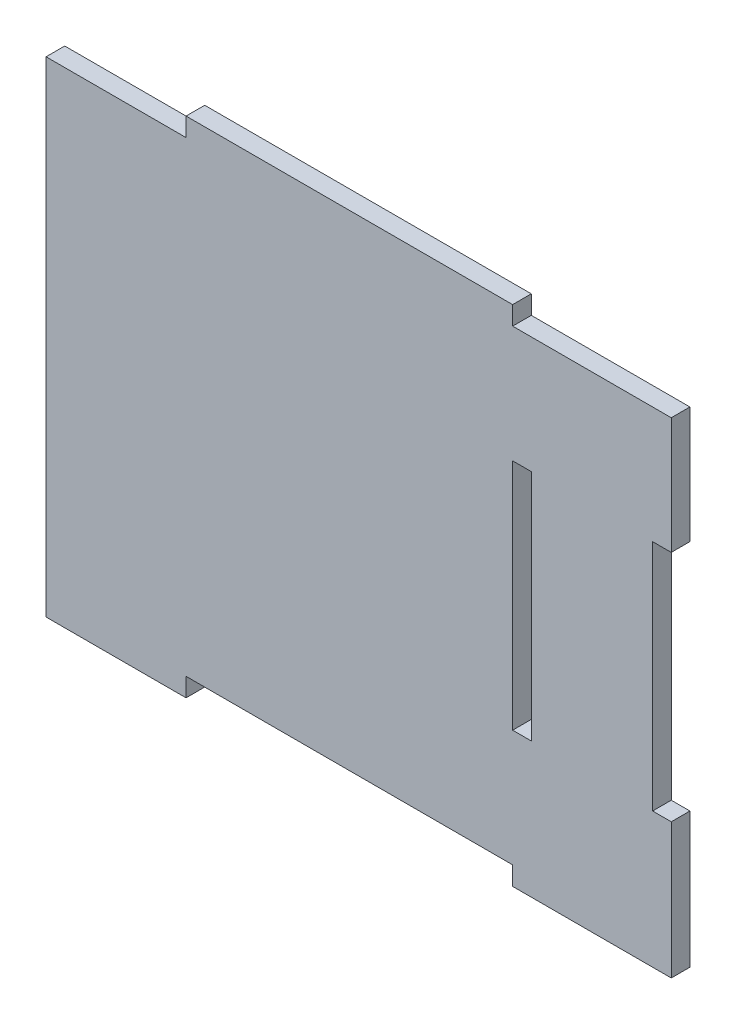
ISO-10303-21;
HEADER;
FILE_DESCRIPTION(('STEP AP214'),'2;1');
FILE_NAME('part.step','',(''),(''),'','','');
FILE_SCHEMA(('AUTOMOTIVE_DESIGN { 1 0 10303 214 1 1 1 1 }'));
ENDSEC;
DATA;
#1=APPLICATION_CONTEXT('core data for automotive mechanical design processes');
#2=APPLICATION_PROTOCOL_DEFINITION('international standard','automotive_design',2000,#1);
#3=PRODUCT_CONTEXT('',#1,'mechanical');
#4=PRODUCT('Part','Part','',(#3));
#5=PRODUCT_RELATED_PRODUCT_CATEGORY('part','',(#4));
#6=PRODUCT_DEFINITION_FORMATION('','',#4);
#7=PRODUCT_DEFINITION_CONTEXT('part definition',#1,'design');
#8=PRODUCT_DEFINITION('design','',#6,#7);
#9=PRODUCT_DEFINITION_SHAPE('','',#8);
#10=(LENGTH_UNIT() NAMED_UNIT(*) SI_UNIT(.MILLI.,.METRE.));
#11=(NAMED_UNIT(*) PLANE_ANGLE_UNIT() SI_UNIT($,.RADIAN.));
#12=(NAMED_UNIT(*) SI_UNIT($,.STERADIAN.) SOLID_ANGLE_UNIT());
#13=UNCERTAINTY_MEASURE_WITH_UNIT(LENGTH_MEASURE(1.E-05),#10,'distance_accuracy_value','');
#14=(GEOMETRIC_REPRESENTATION_CONTEXT(3) GLOBAL_UNCERTAINTY_ASSIGNED_CONTEXT((#13)) GLOBAL_UNIT_ASSIGNED_CONTEXT((#10,
#11,#12)) REPRESENTATION_CONTEXT('',''));
#15=CARTESIAN_POINT('',(0.,0.,0.));
#16=DIRECTION('',(0.,0.,1.));
#17=DIRECTION('',(1.,0.,0.));
#18=AXIS2_PLACEMENT_3D('',#15,#16,#17);
#19=CARTESIAN_POINT('',(0.,0.,4.));
#20=DIRECTION('',(0.,0.,-1.));
#21=DIRECTION('',(-1.,0.,0.));
#22=AXIS2_PLACEMENT_3D('',#19,#20,#21);
#23=PLANE('',#22);
#24=DIRECTION('',(-1.,0.,0.));
#25=VECTOR('',#24,1.);
#26=CARTESIAN_POINT('',(0.,77.2084205096793,4.));
#27=LINE('',#26,#25);
#28=CARTESIAN_POINT('',(3.99999999999999,77.2084205096793,4.));
#29=VERTEX_POINT('',#28);
#30=CARTESIAN_POINT('',(-30.,77.2084205096793,4.));
#31=VERTEX_POINT('',#30);
#32=EDGE_CURVE('E207',#29,#31,#27,.T.);
#33=ORIENTED_EDGE('',*,*,#32,.T.);
#34=DIRECTION('',(0.,1.,0.));
#35=VECTOR('',#34,1.);
#36=CARTESIAN_POINT('',(-30.,77.2084205096793,4.));
#37=LINE('',#36,#35);
#38=CARTESIAN_POINT('',(-30.,81.2084205096793,4.));
#39=VERTEX_POINT('',#38);
#40=EDGE_CURVE('E209',#31,#39,#37,.T.);
#41=ORIENTED_EDGE('',*,*,#40,.T.);
#42=DIRECTION('',(-1.,0.,0.));
#43=VECTOR('',#42,1.);
#44=CARTESIAN_POINT('',(-100.,81.2084205096793,4.));
#45=LINE('',#44,#43);
#46=CARTESIAN_POINT('',(-100.,81.2084205096793,4.));
#47=VERTEX_POINT('',#46);
#48=EDGE_CURVE('E212',#39,#47,#45,.T.);
#49=ORIENTED_EDGE('',*,*,#48,.T.);
#50=DIRECTION('',(0.,-1.,0.));
#51=VECTOR('',#50,1.);
#52=CARTESIAN_POINT('',(-100.,77.2084205096792,4.));
#53=LINE('',#52,#51);
#54=CARTESIAN_POINT('',(-100.,77.2084205096792,4.));
#55=VERTEX_POINT('',#54);
#56=EDGE_CURVE('E214',#47,#55,#53,.T.);
#57=ORIENTED_EDGE('',*,*,#56,.T.);
#58=DIRECTION('',(-1.,0.,0.));
#59=VECTOR('',#58,1.);
#60=CARTESIAN_POINT('',(-100.,77.2084205096792,4.));
#61=LINE('',#60,#59);
#62=CARTESIAN_POINT('',(-130.,77.2084205096792,4.));
#63=VERTEX_POINT('',#62);
#64=EDGE_CURVE('E216',#55,#63,#61,.T.);
#65=ORIENTED_EDGE('',*,*,#64,.T.);
#66=DIRECTION('',(0.,-1.,0.));
#67=VECTOR('',#66,1.);
#68=CARTESIAN_POINT('',(-130.,-22.7915794903208,4.));
#69=LINE('',#68,#67);
#70=CARTESIAN_POINT('',(-130.,-26.7915794903208,4.));
#71=VERTEX_POINT('',#70);
#72=EDGE_CURVE('E218',#63,#71,#69,.T.);
#73=ORIENTED_EDGE('',*,*,#72,.T.);
#74=DIRECTION('',(1.,0.,0.));
#75=VECTOR('',#74,1.);
#76=CARTESIAN_POINT('',(-130.,-26.7915794903208,4.));
#77=LINE('',#76,#75);
#78=CARTESIAN_POINT('',(-100.,-26.7915794903208,4.));
#79=VERTEX_POINT('',#78);
#80=EDGE_CURVE('E220',#71,#79,#77,.T.);
#81=ORIENTED_EDGE('',*,*,#80,.T.);
#82=DIRECTION('',(0.,1.,0.));
#83=VECTOR('',#82,1.);
#84=CARTESIAN_POINT('',(-100.,-22.7915794903208,4.));
#85=LINE('',#84,#83);
#86=CARTESIAN_POINT('',(-100.,-22.7915794903208,4.));
#87=VERTEX_POINT('',#86);
#88=EDGE_CURVE('E222',#79,#87,#85,.T.);
#89=ORIENTED_EDGE('',*,*,#88,.T.);
#90=DIRECTION('',(1.,0.,0.));
#91=VECTOR('',#90,1.);
#92=CARTESIAN_POINT('',(-30.,-22.7915794903208,4.));
#93=LINE('',#92,#91);
#94=CARTESIAN_POINT('',(-30.,-22.7915794903208,4.));
#95=VERTEX_POINT('',#94);
#96=EDGE_CURVE('E224',#87,#95,#93,.T.);
#97=ORIENTED_EDGE('',*,*,#96,.T.);
#98=DIRECTION('',(0.,-1.,0.));
#99=VECTOR('',#98,1.);
#100=CARTESIAN_POINT('',(-30.,-22.7915794903208,4.));
#101=LINE('',#100,#99);
#102=CARTESIAN_POINT('',(-30.,-26.7915794903208,4.));
#103=VERTEX_POINT('',#102);
#104=EDGE_CURVE('E226',#95,#103,#101,.T.);
#105=ORIENTED_EDGE('',*,*,#104,.T.);
#106=DIRECTION('',(1.,0.,0.));
#107=VECTOR('',#106,1.);
#108=CARTESIAN_POINT('',(0.,-26.7915794903207,4.));
#109=LINE('',#108,#107);
#110=CARTESIAN_POINT('',(4.,-26.7915794903208,4.));
#111=VERTEX_POINT('',#110);
#112=EDGE_CURVE('E228',#103,#111,#109,.T.);
#113=ORIENTED_EDGE('',*,*,#112,.T.);
#114=DIRECTION('',(0.,1.,0.));
#115=VECTOR('',#114,1.);
#116=CARTESIAN_POINT('',(4.,2.20842050967925,4.));
#117=LINE('',#116,#115);
#118=CARTESIAN_POINT('',(4.,2.20842050967925,4.));
#119=VERTEX_POINT('',#118);
#120=EDGE_CURVE('E230',#111,#119,#117,.T.);
#121=ORIENTED_EDGE('',*,*,#120,.T.);
#122=DIRECTION('',(-1.,0.,0.));
#123=VECTOR('',#122,1.);
#124=CARTESIAN_POINT('',(0.,2.20842050967925,4.));
#125=LINE('',#124,#123);
#126=CARTESIAN_POINT('',(0.,2.20842050967925,4.));
#127=VERTEX_POINT('',#126);
#128=EDGE_CURVE('E232',#119,#127,#125,.T.);
#129=ORIENTED_EDGE('',*,*,#128,.T.);
#130=DIRECTION('',(0.,1.,0.));
#131=VECTOR('',#130,1.);
#132=CARTESIAN_POINT('',(0.,2.20842050967925,4.));
#133=LINE('',#132,#131);
#134=CARTESIAN_POINT('',(0.,52.2084205096793,4.));
#135=VERTEX_POINT('',#134);
#136=EDGE_CURVE('E234',#127,#135,#133,.T.);
#137=ORIENTED_EDGE('',*,*,#136,.T.);
#138=DIRECTION('',(1.,0.,0.));
#139=VECTOR('',#138,1.);
#140=CARTESIAN_POINT('',(0.,52.2084205096793,4.));
#141=LINE('',#140,#139);
#142=CARTESIAN_POINT('',(4.,52.2084205096793,4.));
#143=VERTEX_POINT('',#142);
#144=EDGE_CURVE('E236',#135,#143,#141,.T.);
#145=ORIENTED_EDGE('',*,*,#144,.T.);
#146=DIRECTION('',(0.,1.,0.));
#147=VECTOR('',#146,1.);
#148=CARTESIAN_POINT('',(3.99999999999999,77.2084205096793,4.));
#149=LINE('',#148,#147);
#150=EDGE_CURVE('E238',#143,#29,#149,.T.);
#151=ORIENTED_EDGE('',*,*,#150,.T.);
#152=EDGE_LOOP('',(#33,#41,#49,#57,#65,#73,#81,#89,#97,#105,#113,#121,#129,#137,#145,#151));
#153=FACE_BOUND('',#152,.T.);
#154=DIRECTION('',(0.,-1.,0.));
#155=VECTOR('',#154,1.);
#156=CARTESIAN_POINT('',(-30.,52.2084205096793,4.));
#157=LINE('',#156,#155);
#158=CARTESIAN_POINT('',(-30.,52.2084205096793,4.));
#159=VERTEX_POINT('',#158);
#160=CARTESIAN_POINT('',(-30.,2.20842050967925,4.));
#161=VERTEX_POINT('',#160);
#162=EDGE_CURVE('E171',#159,#161,#157,.T.);
#163=ORIENTED_EDGE('',*,*,#162,.F.);
#164=DIRECTION('',(-1.,0.,0.));
#165=VECTOR('',#164,1.);
#166=CARTESIAN_POINT('',(-30.,52.2084205096793,4.));
#167=LINE('',#166,#165);
#168=CARTESIAN_POINT('',(-26.,52.2084205096793,4.));
#169=VERTEX_POINT('',#168);
#170=EDGE_CURVE('E193',#169,#159,#167,.T.);
#171=ORIENTED_EDGE('',*,*,#170,.F.);
#172=DIRECTION('',(0.,1.,0.));
#173=VECTOR('',#172,1.);
#174=CARTESIAN_POINT('',(-26.,52.2084205096793,4.));
#175=LINE('',#174,#173);
#176=CARTESIAN_POINT('',(-26.,2.20842050967925,4.));
#177=VERTEX_POINT('',#176);
#178=EDGE_CURVE('E191',#177,#169,#175,.T.);
#179=ORIENTED_EDGE('',*,*,#178,.F.);
#180=DIRECTION('',(1.,0.,0.));
#181=VECTOR('',#180,1.);
#182=CARTESIAN_POINT('',(-30.,2.20842050967925,4.));
#183=LINE('',#182,#181);
#184=EDGE_CURVE('E179',#161,#177,#183,.T.);
#185=ORIENTED_EDGE('',*,*,#184,.F.);
#186=EDGE_LOOP('',(#163,#171,#179,#185));
#187=FACE_BOUND('',#186,.T.);
#188=ADVANCED_FACE('F34',(#153,#187),#23,.F.);
#189=CARTESIAN_POINT('',(0.,0.,0.));
#190=DIRECTION('',(0.,0.,-1.));
#191=DIRECTION('',(-1.,0.,0.));
#192=AXIS2_PLACEMENT_3D('',#189,#190,#191);
#193=PLANE('',#192);
#194=DIRECTION('',(-1.,0.,0.));
#195=VECTOR('',#194,1.);
#196=CARTESIAN_POINT('',(0.,77.2084205096793,0.));
#197=LINE('',#196,#195);
#198=CARTESIAN_POINT('',(3.99999999999999,77.2084205096793,0.));
#199=VERTEX_POINT('',#198);
#200=CARTESIAN_POINT('',(-30.,77.2084205096793,0.));
#201=VERTEX_POINT('',#200);
#202=EDGE_CURVE('E187',#199,#201,#197,.T.);
#203=ORIENTED_EDGE('',*,*,#202,.F.);
#204=DIRECTION('',(0.,1.,0.));
#205=VECTOR('',#204,1.);
#206=CARTESIAN_POINT('',(3.99999999999999,77.2084205096793,0.));
#207=LINE('',#206,#205);
#208=CARTESIAN_POINT('',(4.,52.2084205096793,0.));
#209=VERTEX_POINT('',#208);
#210=EDGE_CURVE('E210',#209,#199,#207,.T.);
#211=ORIENTED_EDGE('',*,*,#210,.F.);
#212=DIRECTION('',(1.,0.,0.));
#213=VECTOR('',#212,1.);
#214=CARTESIAN_POINT('',(0.,52.2084205096793,0.));
#215=LINE('',#214,#213);
#216=CARTESIAN_POINT('',(0.,52.2084205096793,0.));
#217=VERTEX_POINT('',#216);
#218=EDGE_CURVE('E270',#217,#209,#215,.T.);
#219=ORIENTED_EDGE('',*,*,#218,.F.);
#220=DIRECTION('',(0.,1.,0.));
#221=VECTOR('',#220,1.);
#222=CARTESIAN_POINT('',(0.,2.20842050967925,0.));
#223=LINE('',#222,#221);
#224=CARTESIAN_POINT('',(0.,2.20842050967925,0.));
#225=VERTEX_POINT('',#224);
#226=EDGE_CURVE('E268',#225,#217,#223,.T.);
#227=ORIENTED_EDGE('',*,*,#226,.F.);
#228=DIRECTION('',(-1.,0.,0.));
#229=VECTOR('',#228,1.);
#230=CARTESIAN_POINT('',(0.,2.20842050967925,0.));
#231=LINE('',#230,#229);
#232=CARTESIAN_POINT('',(4.,2.20842050967925,0.));
#233=VERTEX_POINT('',#232);
#234=EDGE_CURVE('E266',#233,#225,#231,.T.);
#235=ORIENTED_EDGE('',*,*,#234,.F.);
#236=DIRECTION('',(0.,1.,0.));
#237=VECTOR('',#236,1.);
#238=CARTESIAN_POINT('',(4.,2.20842050967925,0.));
#239=LINE('',#238,#237);
#240=CARTESIAN_POINT('',(4.,-26.7915794903208,0.));
#241=VERTEX_POINT('',#240);
#242=EDGE_CURVE('E264',#241,#233,#239,.T.);
#243=ORIENTED_EDGE('',*,*,#242,.F.);
#244=DIRECTION('',(1.,0.,0.));
#245=VECTOR('',#244,1.);
#246=CARTESIAN_POINT('',(0.,-26.7915794903207,0.));
#247=LINE('',#246,#245);
#248=CARTESIAN_POINT('',(-30.,-26.7915794903208,0.));
#249=VERTEX_POINT('',#248);
#250=EDGE_CURVE('E262',#249,#241,#247,.T.);
#251=ORIENTED_EDGE('',*,*,#250,.F.);
#252=DIRECTION('',(0.,-1.,0.));
#253=VECTOR('',#252,1.);
#254=CARTESIAN_POINT('',(-30.,-22.7915794903208,0.));
#255=LINE('',#254,#253);
#256=CARTESIAN_POINT('',(-30.,-22.7915794903208,0.));
#257=VERTEX_POINT('',#256);
#258=EDGE_CURVE('E259',#257,#249,#255,.T.);
#259=ORIENTED_EDGE('',*,*,#258,.F.);
#260=DIRECTION('',(1.,0.,0.));
#261=VECTOR('',#260,1.);
#262=CARTESIAN_POINT('',(-30.,-22.7915794903208,0.));
#263=LINE('',#262,#261);
#264=CARTESIAN_POINT('',(-100.,-22.7915794903208,0.));
#265=VERTEX_POINT('',#264);
#266=EDGE_CURVE('E257',#265,#257,#263,.T.);
#267=ORIENTED_EDGE('',*,*,#266,.F.);
#268=DIRECTION('',(0.,1.,0.));
#269=VECTOR('',#268,1.);
#270=CARTESIAN_POINT('',(-100.,-22.7915794903208,0.));
#271=LINE('',#270,#269);
#272=CARTESIAN_POINT('',(-100.,-26.7915794903208,0.));
#273=VERTEX_POINT('',#272);
#274=EDGE_CURVE('E255',#273,#265,#271,.T.);
#275=ORIENTED_EDGE('',*,*,#274,.F.);
#276=DIRECTION('',(1.,0.,0.));
#277=VECTOR('',#276,1.);
#278=CARTESIAN_POINT('',(-130.,-26.7915794903208,0.));
#279=LINE('',#278,#277);
#280=CARTESIAN_POINT('',(-130.,-26.7915794903208,0.));
#281=VERTEX_POINT('',#280);
#282=EDGE_CURVE('E253',#281,#273,#279,.T.);
#283=ORIENTED_EDGE('',*,*,#282,.F.);
#284=DIRECTION('',(0.,-1.,0.));
#285=VECTOR('',#284,1.);
#286=CARTESIAN_POINT('',(-130.,-22.7915794903208,0.));
#287=LINE('',#286,#285);
#288=CARTESIAN_POINT('',(-130.,77.2084205096792,0.));
#289=VERTEX_POINT('',#288);
#290=EDGE_CURVE('E251',#289,#281,#287,.T.);
#291=ORIENTED_EDGE('',*,*,#290,.F.);
#292=DIRECTION('',(-1.,0.,0.));
#293=VECTOR('',#292,1.);
#294=CARTESIAN_POINT('',(-100.,77.2084205096792,0.));
#295=LINE('',#294,#293);
#296=CARTESIAN_POINT('',(-100.,77.2084205096792,0.));
#297=VERTEX_POINT('',#296);
#298=EDGE_CURVE('E248',#297,#289,#295,.T.);
#299=ORIENTED_EDGE('',*,*,#298,.F.);
#300=DIRECTION('',(0.,-1.,0.));
#301=VECTOR('',#300,1.);
#302=CARTESIAN_POINT('',(-100.,77.2084205096792,0.));
#303=LINE('',#302,#301);
#304=CARTESIAN_POINT('',(-100.,81.2084205096793,0.));
#305=VERTEX_POINT('',#304);
#306=EDGE_CURVE('E246',#305,#297,#303,.T.);
#307=ORIENTED_EDGE('',*,*,#306,.F.);
#308=DIRECTION('',(-1.,0.,0.));
#309=VECTOR('',#308,1.);
#310=CARTESIAN_POINT('',(-100.,81.2084205096793,0.));
#311=LINE('',#310,#309);
#312=CARTESIAN_POINT('',(-30.,81.2084205096793,0.));
#313=VERTEX_POINT('',#312);
#314=EDGE_CURVE('E244',#313,#305,#311,.T.);
#315=ORIENTED_EDGE('',*,*,#314,.F.);
#316=DIRECTION('',(0.,1.,0.));
#317=VECTOR('',#316,1.);
#318=CARTESIAN_POINT('',(-30.,77.2084205096793,0.));
#319=LINE('',#318,#317);
#320=EDGE_CURVE('E242',#201,#313,#319,.T.);
#321=ORIENTED_EDGE('',*,*,#320,.F.);
#322=EDGE_LOOP('',(#203,#211,#219,#227,#235,#243,#251,#259,#267,#275,#283,#291,#299,#307,#315,#321));
#323=FACE_BOUND('',#322,.T.);
#324=DIRECTION('',(-1.,0.,0.));
#325=VECTOR('',#324,1.);
#326=CARTESIAN_POINT('',(-30.,52.2084205096793,0.));
#327=LINE('',#326,#325);
#328=CARTESIAN_POINT('',(-26.,52.2084205096793,0.));
#329=VERTEX_POINT('',#328);
#330=CARTESIAN_POINT('',(-30.,52.2084205096793,0.));
#331=VERTEX_POINT('',#330);
#332=EDGE_CURVE('E180',#329,#331,#327,.T.);
#333=ORIENTED_EDGE('',*,*,#332,.T.);
#334=DIRECTION('',(0.,-1.,0.));
#335=VECTOR('',#334,1.);
#336=CARTESIAN_POINT('',(-30.,52.2084205096793,0.));
#337=LINE('',#336,#335);
#338=CARTESIAN_POINT('',(-30.,2.20842050967925,0.));
#339=VERTEX_POINT('',#338);
#340=EDGE_CURVE('E57',#331,#339,#337,.T.);
#341=ORIENTED_EDGE('',*,*,#340,.T.);
#342=DIRECTION('',(1.,0.,0.));
#343=VECTOR('',#342,1.);
#344=CARTESIAN_POINT('',(-30.,2.20842050967925,0.));
#345=LINE('',#344,#343);
#346=CARTESIAN_POINT('',(-26.,2.20842050967925,0.));
#347=VERTEX_POINT('',#346);
#348=EDGE_CURVE('E186',#339,#347,#345,.T.);
#349=ORIENTED_EDGE('',*,*,#348,.T.);
#350=DIRECTION('',(0.,1.,0.));
#351=VECTOR('',#350,1.);
#352=CARTESIAN_POINT('',(-26.,52.2084205096793,0.));
#353=LINE('',#352,#351);
#354=EDGE_CURVE('E199',#347,#329,#353,.T.);
#355=ORIENTED_EDGE('',*,*,#354,.T.);
#356=EDGE_LOOP('',(#333,#341,#349,#355));
#357=FACE_BOUND('',#356,.T.);
#358=ADVANCED_FACE('F326',(#323,#357),#193,.T.);
#359=CARTESIAN_POINT('',(0.,77.2084205096793,4.));
#360=DIRECTION('',(0.,-1.,0.));
#361=DIRECTION('',(0.,0.,-1.));
#362=AXIS2_PLACEMENT_3D('',#359,#360,#361);
#363=PLANE('',#362);
#364=ORIENTED_EDGE('',*,*,#202,.T.);
#365=DIRECTION('',(0.,0.,-1.));
#366=VECTOR('',#365,1.);
#367=CARTESIAN_POINT('',(-30.,77.2084205096793,4.));
#368=LINE('',#367,#366);
#369=EDGE_CURVE('E11',#31,#201,#368,.T.);
#370=ORIENTED_EDGE('',*,*,#369,.F.);
#371=ORIENTED_EDGE('',*,*,#32,.F.);
#372=DIRECTION('',(0.,0.,-1.));
#373=VECTOR('',#372,1.);
#374=CARTESIAN_POINT('',(3.99999999999999,77.2084205096793,4.));
#375=LINE('',#374,#373);
#376=EDGE_CURVE('E240',#29,#199,#375,.T.);
#377=ORIENTED_EDGE('',*,*,#376,.T.);
#378=EDGE_LOOP('',(#364,#370,#371,#377));
#379=FACE_BOUND('',#378,.T.);
#380=ADVANCED_FACE('F36',(#379),#363,.F.);
#381=CARTESIAN_POINT('',(-30.,77.2084205096793,4.));
#382=DIRECTION('',(-1.,0.,0.));
#383=DIRECTION('',(0.,0.,1.));
#384=AXIS2_PLACEMENT_3D('',#381,#382,#383);
#385=PLANE('',#384);
#386=ORIENTED_EDGE('',*,*,#320,.T.);
#387=DIRECTION('',(0.,0.,-1.));
#388=VECTOR('',#387,1.);
#389=CARTESIAN_POINT('',(-30.,81.2084205096793,4.));
#390=LINE('',#389,#388);
#391=EDGE_CURVE('E42',#39,#313,#390,.T.);
#392=ORIENTED_EDGE('',*,*,#391,.F.);
#393=ORIENTED_EDGE('',*,*,#40,.F.);
#394=ORIENTED_EDGE('',*,*,#369,.T.);
#395=EDGE_LOOP('',(#386,#392,#393,#394));
#396=FACE_BOUND('',#395,.T.);
#397=ADVANCED_FACE('F342',(#396),#385,.F.);
#398=CARTESIAN_POINT('',(-100.,81.2084205096793,4.));
#399=DIRECTION('',(0.,-1.,0.));
#400=DIRECTION('',(0.,0.,-1.));
#401=AXIS2_PLACEMENT_3D('',#398,#399,#400);
#402=PLANE('',#401);
#403=ORIENTED_EDGE('',*,*,#314,.T.);
#404=DIRECTION('',(0.,0.,-1.));
#405=VECTOR('',#404,1.);
#406=CARTESIAN_POINT('',(-100.,81.2084205096793,4.));
#407=LINE('',#406,#405);
#408=EDGE_CURVE('E312',#47,#305,#407,.T.);
#409=ORIENTED_EDGE('',*,*,#408,.F.);
#410=ORIENTED_EDGE('',*,*,#48,.F.);
#411=ORIENTED_EDGE('',*,*,#391,.T.);
#412=EDGE_LOOP('',(#403,#409,#410,#411));
#413=FACE_BOUND('',#412,.T.);
#414=ADVANCED_FACE('F319',(#413),#402,.F.);
#415=CARTESIAN_POINT('',(-100.,77.2084205096792,4.));
#416=DIRECTION('',(1.,0.,0.));
#417=DIRECTION('',(0.,0.,-1.));
#418=AXIS2_PLACEMENT_3D('',#415,#416,#417);
#419=PLANE('',#418);
#420=ORIENTED_EDGE('',*,*,#306,.T.);
#421=DIRECTION('',(0.,0.,-1.));
#422=VECTOR('',#421,1.);
#423=CARTESIAN_POINT('',(-100.,77.2084205096792,4.));
#424=LINE('',#423,#422);
#425=EDGE_CURVE('E309',#55,#297,#424,.T.);
#426=ORIENTED_EDGE('',*,*,#425,.F.);
#427=ORIENTED_EDGE('',*,*,#56,.F.);
#428=ORIENTED_EDGE('',*,*,#408,.T.);
#429=EDGE_LOOP('',(#420,#426,#427,#428));
#430=FACE_BOUND('',#429,.T.);
#431=ADVANCED_FACE('F331',(#430),#419,.F.);
#432=CARTESIAN_POINT('',(-100.,77.2084205096792,4.));
#433=DIRECTION('',(0.,-1.,0.));
#434=DIRECTION('',(0.,0.,-1.));
#435=AXIS2_PLACEMENT_3D('',#432,#433,#434);
#436=PLANE('',#435);
#437=ORIENTED_EDGE('',*,*,#298,.T.);
#438=DIRECTION('',(0.,0.,-1.));
#439=VECTOR('',#438,1.);
#440=CARTESIAN_POINT('',(-130.,77.2084205096792,4.));
#441=LINE('',#440,#439);
#442=EDGE_CURVE('E306',#63,#289,#441,.T.);
#443=ORIENTED_EDGE('',*,*,#442,.F.);
#444=ORIENTED_EDGE('',*,*,#64,.F.);
#445=ORIENTED_EDGE('',*,*,#425,.T.);
#446=EDGE_LOOP('',(#437,#443,#444,#445));
#447=FACE_BOUND('',#446,.T.);
#448=ADVANCED_FACE('F335',(#447),#436,.F.);
#449=CARTESIAN_POINT('',(-130.,-22.7915794903208,4.));
#450=DIRECTION('',(1.,0.,0.));
#451=DIRECTION('',(0.,0.,-1.));
#452=AXIS2_PLACEMENT_3D('',#449,#450,#451);
#453=PLANE('',#452);
#454=ORIENTED_EDGE('',*,*,#290,.T.);
#455=DIRECTION('',(0.,0.,-1.));
#456=VECTOR('',#455,1.);
#457=CARTESIAN_POINT('',(-130.,-26.7915794903208,4.));
#458=LINE('',#457,#456);
#459=EDGE_CURVE('E303',#71,#281,#458,.T.);
#460=ORIENTED_EDGE('',*,*,#459,.F.);
#461=ORIENTED_EDGE('',*,*,#72,.F.);
#462=ORIENTED_EDGE('',*,*,#442,.T.);
#463=EDGE_LOOP('',(#454,#460,#461,#462));
#464=FACE_BOUND('',#463,.T.);
#465=ADVANCED_FACE('F394',(#464),#453,.F.);
#466=CARTESIAN_POINT('',(-130.,-26.7915794903208,4.));
#467=DIRECTION('',(0.,1.,0.));
#468=DIRECTION('',(-1.,0.,0.));
#469=AXIS2_PLACEMENT_3D('',#466,#467,#468);
#470=PLANE('',#469);
#471=ORIENTED_EDGE('',*,*,#282,.T.);
#472=DIRECTION('',(0.,0.,-1.));
#473=VECTOR('',#472,1.);
#474=CARTESIAN_POINT('',(-100.,-26.7915794903208,4.));
#475=LINE('',#474,#473);
#476=EDGE_CURVE('E300',#79,#273,#475,.T.);
#477=ORIENTED_EDGE('',*,*,#476,.F.);
#478=ORIENTED_EDGE('',*,*,#80,.F.);
#479=ORIENTED_EDGE('',*,*,#459,.T.);
#480=EDGE_LOOP('',(#471,#477,#478,#479));
#481=FACE_BOUND('',#480,.T.);
#482=ADVANCED_FACE('F392',(#481),#470,.F.);
#483=CARTESIAN_POINT('',(-100.,-22.7915794903208,4.));
#484=DIRECTION('',(-1.,0.,0.));
#485=DIRECTION('',(0.,0.,1.));
#486=AXIS2_PLACEMENT_3D('',#483,#484,#485);
#487=PLANE('',#486);
#488=ORIENTED_EDGE('',*,*,#274,.T.);
#489=DIRECTION('',(0.,0.,-1.));
#490=VECTOR('',#489,1.);
#491=CARTESIAN_POINT('',(-100.,-22.7915794903208,4.));
#492=LINE('',#491,#490);
#493=EDGE_CURVE('E297',#87,#265,#492,.T.);
#494=ORIENTED_EDGE('',*,*,#493,.F.);
#495=ORIENTED_EDGE('',*,*,#88,.F.);
#496=ORIENTED_EDGE('',*,*,#476,.T.);
#497=EDGE_LOOP('',(#488,#494,#495,#496));
#498=FACE_BOUND('',#497,.T.);
#499=ADVANCED_FACE('F388',(#498),#487,.F.);
#500=CARTESIAN_POINT('',(-30.,-22.7915794903208,4.));
#501=DIRECTION('',(0.,1.,0.));
#502=DIRECTION('',(-1.,0.,0.));
#503=AXIS2_PLACEMENT_3D('',#500,#501,#502);
#504=PLANE('',#503);
#505=ORIENTED_EDGE('',*,*,#266,.T.);
#506=DIRECTION('',(0.,0.,-1.));
#507=VECTOR('',#506,1.);
#508=CARTESIAN_POINT('',(-30.,-22.7915794903208,4.));
#509=LINE('',#508,#507);
#510=EDGE_CURVE('E294',#95,#257,#509,.T.);
#511=ORIENTED_EDGE('',*,*,#510,.F.);
#512=ORIENTED_EDGE('',*,*,#96,.F.);
#513=ORIENTED_EDGE('',*,*,#493,.T.);
#514=EDGE_LOOP('',(#505,#511,#512,#513));
#515=FACE_BOUND('',#514,.T.);
#516=ADVANCED_FACE('F384',(#515),#504,.F.);
#517=CARTESIAN_POINT('',(-30.,-22.7915794903208,4.));
#518=DIRECTION('',(1.,0.,0.));
#519=DIRECTION('',(0.,0.,-1.));
#520=AXIS2_PLACEMENT_3D('',#517,#518,#519);
#521=PLANE('',#520);
#522=ORIENTED_EDGE('',*,*,#258,.T.);
#523=DIRECTION('',(0.,0.,-1.));
#524=VECTOR('',#523,1.);
#525=CARTESIAN_POINT('',(-30.,-26.7915794903208,4.));
#526=LINE('',#525,#524);
#527=EDGE_CURVE('E291',#103,#249,#526,.T.);
#528=ORIENTED_EDGE('',*,*,#527,.F.);
#529=ORIENTED_EDGE('',*,*,#104,.F.);
#530=ORIENTED_EDGE('',*,*,#510,.T.);
#531=EDGE_LOOP('',(#522,#528,#529,#530));
#532=FACE_BOUND('',#531,.T.);
#533=ADVANCED_FACE('F375',(#532),#521,.F.);
#534=CARTESIAN_POINT('',(0.,-26.7915794903207,4.));
#535=DIRECTION('',(0.,1.,0.));
#536=DIRECTION('',(-1.,0.,0.));
#537=AXIS2_PLACEMENT_3D('',#534,#535,#536);
#538=PLANE('',#537);
#539=ORIENTED_EDGE('',*,*,#250,.T.);
#540=DIRECTION('',(0.,0.,-1.));
#541=VECTOR('',#540,1.);
#542=CARTESIAN_POINT('',(4.,-26.7915794903208,4.));
#543=LINE('',#542,#541);
#544=EDGE_CURVE('E288',#111,#241,#543,.T.);
#545=ORIENTED_EDGE('',*,*,#544,.F.);
#546=ORIENTED_EDGE('',*,*,#112,.F.);
#547=ORIENTED_EDGE('',*,*,#527,.T.);
#548=EDGE_LOOP('',(#539,#545,#546,#547));
#549=FACE_BOUND('',#548,.T.);
#550=ADVANCED_FACE('F379',(#549),#538,.F.);
#551=CARTESIAN_POINT('',(4.,2.20842050967925,4.));
#552=DIRECTION('',(-1.,0.,0.));
#553=DIRECTION('',(0.,-1.,0.));
#554=AXIS2_PLACEMENT_3D('',#551,#552,#553);
#555=PLANE('',#554);
#556=ORIENTED_EDGE('',*,*,#242,.T.);
#557=DIRECTION('',(0.,0.,-1.));
#558=VECTOR('',#557,1.);
#559=CARTESIAN_POINT('',(4.,2.20842050967925,4.));
#560=LINE('',#559,#558);
#561=EDGE_CURVE('E285',#119,#233,#560,.T.);
#562=ORIENTED_EDGE('',*,*,#561,.F.);
#563=ORIENTED_EDGE('',*,*,#120,.F.);
#564=ORIENTED_EDGE('',*,*,#544,.T.);
#565=EDGE_LOOP('',(#556,#562,#563,#564));
#566=FACE_BOUND('',#565,.T.);
#567=ADVANCED_FACE('F368',(#566),#555,.F.);
#568=CARTESIAN_POINT('',(0.,2.20842050967925,4.));
#569=DIRECTION('',(0.,-1.,0.));
#570=DIRECTION('',(0.,0.,-1.));
#571=AXIS2_PLACEMENT_3D('',#568,#569,#570);
#572=PLANE('',#571);
#573=ORIENTED_EDGE('',*,*,#234,.T.);
#574=DIRECTION('',(0.,0.,-1.));
#575=VECTOR('',#574,1.);
#576=CARTESIAN_POINT('',(0.,2.20842050967925,4.));
#577=LINE('',#576,#575);
#578=EDGE_CURVE('E282',#127,#225,#577,.T.);
#579=ORIENTED_EDGE('',*,*,#578,.F.);
#580=ORIENTED_EDGE('',*,*,#128,.F.);
#581=ORIENTED_EDGE('',*,*,#561,.T.);
#582=EDGE_LOOP('',(#573,#579,#580,#581));
#583=FACE_BOUND('',#582,.T.);
#584=ADVANCED_FACE('F364',(#583),#572,.F.);
#585=CARTESIAN_POINT('',(0.,2.20842050967925,4.));
#586=DIRECTION('',(-1.,0.,0.));
#587=DIRECTION('',(0.,0.,1.));
#588=AXIS2_PLACEMENT_3D('',#585,#586,#587);
#589=PLANE('',#588);
#590=ORIENTED_EDGE('',*,*,#226,.T.);
#591=DIRECTION('',(0.,0.,-1.));
#592=VECTOR('',#591,1.);
#593=CARTESIAN_POINT('',(0.,52.2084205096793,4.));
#594=LINE('',#593,#592);
#595=EDGE_CURVE('E279',#135,#217,#594,.T.);
#596=ORIENTED_EDGE('',*,*,#595,.F.);
#597=ORIENTED_EDGE('',*,*,#136,.F.);
#598=ORIENTED_EDGE('',*,*,#578,.T.);
#599=EDGE_LOOP('',(#590,#596,#597,#598));
#600=FACE_BOUND('',#599,.T.);
#601=ADVANCED_FACE('F359',(#600),#589,.F.);
#602=CARTESIAN_POINT('',(0.,52.2084205096793,4.));
#603=DIRECTION('',(0.,1.,0.));
#604=DIRECTION('',(-1.,0.,0.));
#605=AXIS2_PLACEMENT_3D('',#602,#603,#604);
#606=PLANE('',#605);
#607=ORIENTED_EDGE('',*,*,#218,.T.);
#608=DIRECTION('',(0.,0.,-1.));
#609=VECTOR('',#608,1.);
#610=CARTESIAN_POINT('',(4.,52.2084205096793,4.));
#611=LINE('',#610,#609);
#612=EDGE_CURVE('E276',#143,#209,#611,.T.);
#613=ORIENTED_EDGE('',*,*,#612,.F.);
#614=ORIENTED_EDGE('',*,*,#144,.F.);
#615=ORIENTED_EDGE('',*,*,#595,.T.);
#616=EDGE_LOOP('',(#607,#613,#614,#615));
#617=FACE_BOUND('',#616,.T.);
#618=ADVANCED_FACE('F353',(#617),#606,.F.);
#619=CARTESIAN_POINT('',(3.99999999999999,77.2084205096793,4.));
#620=DIRECTION('',(-1.,0.,0.));
#621=DIRECTION('',(0.,-1.,0.));
#622=AXIS2_PLACEMENT_3D('',#619,#620,#621);
#623=PLANE('',#622);
#624=ORIENTED_EDGE('',*,*,#210,.T.);
#625=ORIENTED_EDGE('',*,*,#376,.F.);
#626=ORIENTED_EDGE('',*,*,#150,.F.);
#627=ORIENTED_EDGE('',*,*,#612,.T.);
#628=EDGE_LOOP('',(#624,#625,#626,#627));
#629=FACE_BOUND('',#628,.T.);
#630=ADVANCED_FACE('F348',(#629),#623,.F.);
#631=CARTESIAN_POINT('',(-30.,52.2084205096793,4.));
#632=DIRECTION('',(1.,0.,0.));
#633=DIRECTION('',(0.,1.,0.));
#634=AXIS2_PLACEMENT_3D('',#631,#632,#633);
#635=PLANE('',#634);
#636=ORIENTED_EDGE('',*,*,#340,.F.);
#637=DIRECTION('',(0.,0.,-1.));
#638=VECTOR('',#637,1.);
#639=CARTESIAN_POINT('',(-30.,52.2084205096793,4.));
#640=LINE('',#639,#638);
#641=EDGE_CURVE('E175',#159,#331,#640,.T.);
#642=ORIENTED_EDGE('',*,*,#641,.F.);
#643=ORIENTED_EDGE('',*,*,#162,.T.);
#644=DIRECTION('',(0.,0.,-1.));
#645=VECTOR('',#644,1.);
#646=CARTESIAN_POINT('',(-30.,2.20842050967925,4.));
#647=LINE('',#646,#645);
#648=EDGE_CURVE('E174',#161,#339,#647,.T.);
#649=ORIENTED_EDGE('',*,*,#648,.T.);
#650=EDGE_LOOP('',(#636,#642,#643,#649));
#651=FACE_BOUND('',#650,.T.);
#652=ADVANCED_FACE('F173',(#651),#635,.T.);
#653=CARTESIAN_POINT('',(-30.,2.20842050967925,4.));
#654=DIRECTION('',(0.,1.,0.));
#655=DIRECTION('',(0.,0.,1.));
#656=AXIS2_PLACEMENT_3D('',#653,#654,#655);
#657=PLANE('',#656);
#658=ORIENTED_EDGE('',*,*,#348,.F.);
#659=ORIENTED_EDGE('',*,*,#648,.F.);
#660=ORIENTED_EDGE('',*,*,#184,.T.);
#661=DIRECTION('',(0.,0.,-1.));
#662=VECTOR('',#661,1.);
#663=CARTESIAN_POINT('',(-26.,2.20842050967925,4.));
#664=LINE('',#663,#662);
#665=EDGE_CURVE('E188',#177,#347,#664,.T.);
#666=ORIENTED_EDGE('',*,*,#665,.T.);
#667=EDGE_LOOP('',(#658,#659,#660,#666));
#668=FACE_BOUND('',#667,.T.);
#669=ADVANCED_FACE('F183',(#668),#657,.T.);
#670=CARTESIAN_POINT('',(-26.,52.2084205096793,4.));
#671=DIRECTION('',(-1.,0.,0.));
#672=DIRECTION('',(0.,-1.,0.));
#673=AXIS2_PLACEMENT_3D('',#670,#671,#672);
#674=PLANE('',#673);
#675=ORIENTED_EDGE('',*,*,#354,.F.);
#676=ORIENTED_EDGE('',*,*,#665,.F.);
#677=ORIENTED_EDGE('',*,*,#178,.T.);
#678=DIRECTION('',(0.,0.,-1.));
#679=VECTOR('',#678,1.);
#680=CARTESIAN_POINT('',(-26.,52.2084205096793,4.));
#681=LINE('',#680,#679);
#682=EDGE_CURVE('E49',#169,#329,#681,.T.);
#683=ORIENTED_EDGE('',*,*,#682,.T.);
#684=EDGE_LOOP('',(#675,#676,#677,#683));
#685=FACE_BOUND('',#684,.T.);
#686=ADVANCED_FACE('F476',(#685),#674,.T.);
#687=CARTESIAN_POINT('',(-30.,52.2084205096793,4.));
#688=DIRECTION('',(0.,-1.,0.));
#689=DIRECTION('',(1.,0.,0.));
#690=AXIS2_PLACEMENT_3D('',#687,#688,#689);
#691=PLANE('',#690);
#692=ORIENTED_EDGE('',*,*,#332,.F.);
#693=ORIENTED_EDGE('',*,*,#682,.F.);
#694=ORIENTED_EDGE('',*,*,#170,.T.);
#695=ORIENTED_EDGE('',*,*,#641,.T.);
#696=EDGE_LOOP('',(#692,#693,#694,#695));
#697=FACE_BOUND('',#696,.T.);
#698=ADVANCED_FACE('F482',(#697),#691,.T.);
#699=CLOSED_SHELL('',(#188,#358,#380,#397,#414,#431,#448,#465,#482,#499,#516,#533,#550,#567,
#584,#601,#618,#630,#652,#669,#686,#698));
#700=MANIFOLD_SOLID_BREP('B2',#699);
#701=ADVANCED_BREP_SHAPE_REPRESENTATION('',(#18,#700),#14);
#702=SHAPE_DEFINITION_REPRESENTATION(#9,#701);
ENDSEC;
END-ISO-10303-21;
